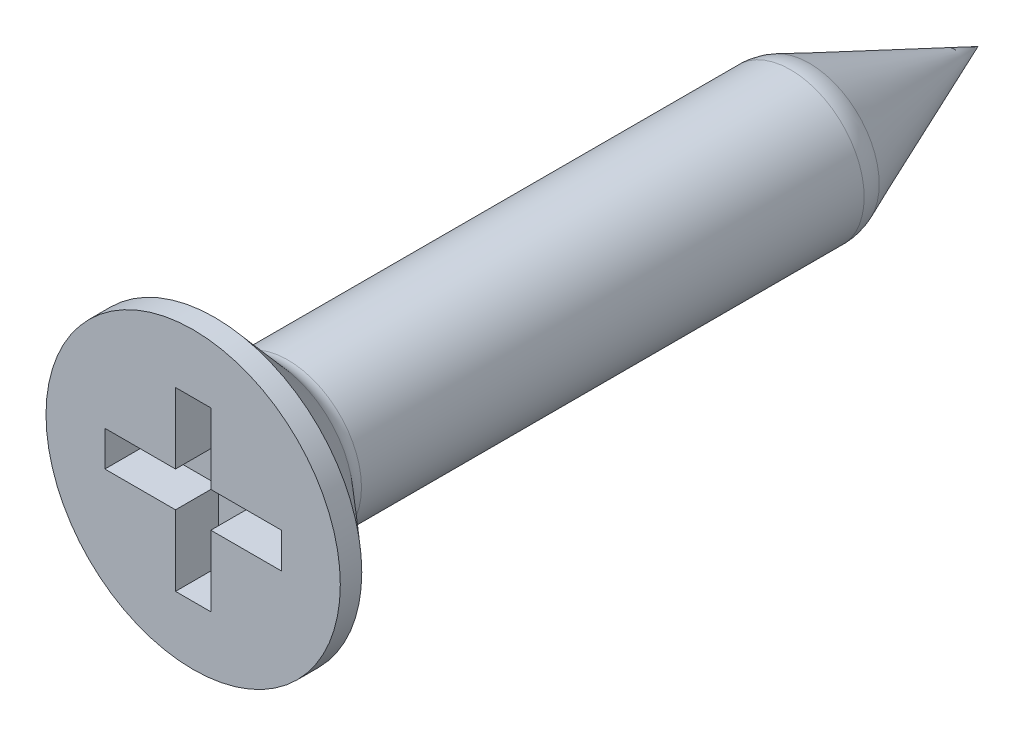
ISO-10303-21;
HEADER;
FILE_DESCRIPTION(('STEP AP214'),'2;1');
FILE_NAME('part.step','',(''),(''),'','','');
FILE_SCHEMA(('AUTOMOTIVE_DESIGN { 1 0 10303 214 1 1 1 1 }'));
ENDSEC;
DATA;
#1=APPLICATION_CONTEXT('core data for automotive mechanical design processes');
#2=APPLICATION_PROTOCOL_DEFINITION('international standard','automotive_design',2000,#1);
#3=PRODUCT_CONTEXT('',#1,'mechanical');
#4=PRODUCT('Part','Part','',(#3));
#5=PRODUCT_RELATED_PRODUCT_CATEGORY('part','',(#4));
#6=PRODUCT_DEFINITION_FORMATION('','',#4);
#7=PRODUCT_DEFINITION_CONTEXT('part definition',#1,'design');
#8=PRODUCT_DEFINITION('design','',#6,#7);
#9=PRODUCT_DEFINITION_SHAPE('','',#8);
#10=(LENGTH_UNIT() NAMED_UNIT(*) SI_UNIT(.MILLI.,.METRE.));
#11=(NAMED_UNIT(*) PLANE_ANGLE_UNIT() SI_UNIT($,.RADIAN.));
#12=(NAMED_UNIT(*) SI_UNIT($,.STERADIAN.) SOLID_ANGLE_UNIT());
#13=UNCERTAINTY_MEASURE_WITH_UNIT(LENGTH_MEASURE(1.E-05),#10,'distance_accuracy_value','');
#14=(GEOMETRIC_REPRESENTATION_CONTEXT(3) GLOBAL_UNCERTAINTY_ASSIGNED_CONTEXT((#13)) GLOBAL_UNIT_ASSIGNED_CONTEXT((#10,
#11,#12)) REPRESENTATION_CONTEXT('',''));
#15=CARTESIAN_POINT('',(0.,0.,0.));
#16=DIRECTION('',(0.,0.,1.));
#17=DIRECTION('',(1.,0.,0.));
#18=AXIS2_PLACEMENT_3D('',#15,#16,#17);
#19=CARTESIAN_POINT('',(0.,0.,94.2432124352331));
#20=DIRECTION('',(0.,0.,1.));
#21=DIRECTION('',(1.,0.,0.));
#22=AXIS2_PLACEMENT_3D('',#19,#20,#21);
#23=CYLINDRICAL_SURFACE('',#22,3.);
#24=CARTESIAN_POINT('',(0.,0.,1.75));
#25=DIRECTION('',(0.,0.,1.));
#26=DIRECTION('',(1.,0.,0.));
#27=AXIS2_PLACEMENT_3D('',#24,#25,#26);
#28=CIRCLE('',#27,3.);
#29=CARTESIAN_POINT('',(3.,0.,1.75));
#30=VERTEX_POINT('',#29);
#31=EDGE_CURVE('E239',#30,#30,#28,.T.);
#32=ORIENTED_EDGE('',*,*,#31,.F.);
#33=EDGE_LOOP('',(#32));
#34=FACE_BOUND('',#33,.T.);
#35=CARTESIAN_POINT('',(0.,0.,1.3125));
#36=DIRECTION('',(0.,0.,1.));
#37=DIRECTION('',(1.,0.,0.));
#38=AXIS2_PLACEMENT_3D('',#35,#36,#37);
#39=CIRCLE('',#38,3.);
#40=CARTESIAN_POINT('',(3.,0.,1.3125));
#41=VERTEX_POINT('',#40);
#42=EDGE_CURVE('E271',#41,#41,#39,.T.);
#43=ORIENTED_EDGE('',*,*,#42,.T.);
#44=EDGE_LOOP('',(#43));
#45=FACE_BOUND('',#44,.T.);
#46=ADVANCED_FACE('F40',(#34,#45),#23,.T.);
#47=CARTESIAN_POINT('',(0.,0.,0.));
#48=DIRECTION('',(0.,0.,1.));
#49=DIRECTION('',(1.,0.,0.));
#50=AXIS2_PLACEMENT_3D('',#47,#48,#49);
#51=CONICAL_SURFACE('',#50,1.5,0.851966327173272);
#52=CARTESIAN_POINT('',(0.,0.,0.119523387246018));
#53=DIRECTION('',(0.,0.,1.));
#54=DIRECTION('',(1.,0.,0.));
#55=AXIS2_PLACEMENT_3D('',#52,#53,#54);
#56=CIRCLE('',#55,1.63659815685259);
#57=CARTESIAN_POINT('',(1.63659815685259,0.,0.119523387246018));
#58=VERTEX_POINT('',#57);
#59=EDGE_CURVE('E275',#58,#58,#56,.T.);
#60=ORIENTED_EDGE('',*,*,#59,.T.);
#61=EDGE_LOOP('',(#60));
#62=FACE_BOUND('',#61,.T.);
#63=ORIENTED_EDGE('',*,*,#42,.F.);
#64=EDGE_LOOP('',(#63));
#65=FACE_BOUND('',#64,.T.);
#66=ADVANCED_FACE('F298',(#62,#65),#51,.T.);
#67=CARTESIAN_POINT('',(0.,0.,94.2432124352331));
#68=DIRECTION('',(0.,0.,1.));
#69=DIRECTION('',(1.,0.,0.));
#70=AXIS2_PLACEMENT_3D('',#67,#68,#69);
#71=CYLINDRICAL_SURFACE('',#70,1.5);
#72=CARTESIAN_POINT('',(0.,0.,-10.4297672890606));
#73=DIRECTION('',(0.,0.,-1.));
#74=DIRECTION('',(-1.,0.,0.));
#75=AXIS2_PLACEMENT_3D('',#72,#73,#74);
#76=CIRCLE('',#75,1.5);
#77=CARTESIAN_POINT('',(-1.5,0.,-10.4297672890606));
#78=VERTEX_POINT('',#77);
#79=EDGE_CURVE('E49',#78,#78,#76,.F.);
#80=ORIENTED_EDGE('',*,*,#79,.T.);
#81=EDGE_LOOP('',(#80));
#82=FACE_BOUND('',#81,.T.);
#83=CARTESIAN_POINT('',(0.,0.,-0.181507290636734));
#84=DIRECTION('',(0.,0.,1.));
#85=DIRECTION('',(1.,0.,0.));
#86=AXIS2_PLACEMENT_3D('',#83,#84,#85);
#87=CIRCLE('',#86,1.5);
#88=CARTESIAN_POINT('',(1.5,0.,-0.181507290636734));
#89=VERTEX_POINT('',#88);
#90=EDGE_CURVE('E279',#89,#89,#87,.F.);
#91=ORIENTED_EDGE('',*,*,#90,.T.);
#92=EDGE_LOOP('',(#91));
#93=FACE_BOUND('',#92,.T.);
#94=ADVANCED_FACE('F286',(#82,#93),#71,.T.);
#95=CARTESIAN_POINT('',(0.,0.,-14.25));
#96=DIRECTION('',(0.,0.,1.));
#97=DIRECTION('',(1.,0.,0.));
#98=AXIS2_PLACEMENT_3D('',#95,#96,#97);
#99=CONICAL_SURFACE('',#98,0.,0.392699081698717);
#100=CARTESIAN_POINT('',(0.,0.,-10.8124507214257));
#101=DIRECTION('',(0.,0.,-1.));
#102=DIRECTION('',(-1.,0.,0.));
#103=AXIS2_PLACEMENT_3D('',#100,#101,#102);
#104=CIRCLE('',#103,1.42387953251129);
#105=CARTESIAN_POINT('',(-1.42387953251129,0.,-10.8124507214257));
#106=VERTEX_POINT('',#105);
#107=EDGE_CURVE('E11',#106,#106,#104,.T.);
#108=ORIENTED_EDGE('',*,*,#107,.T.);
#109=EDGE_LOOP('',(#108));
#110=FACE_BOUND('',#109,.T.);
#111=CARTESIAN_POINT('',(0.,0.,-14.25));
#112=VERTEX_POINT('',#111);
#113=VERTEX_LOOP('',#112);
#114=FACE_BOUND('',#113,.T.);
#115=ADVANCED_FACE('F311',(#110,#114),#99,.T.);
#116=CARTESIAN_POINT('',(0.,0.,1.75));
#117=DIRECTION('',(0.,0.,-1.));
#118=DIRECTION('',(-1.,0.,0.));
#119=AXIS2_PLACEMENT_3D('',#116,#117,#118);
#120=PLANE('',#119);
#121=DIRECTION('',(-1.,0.,0.));
#122=VECTOR('',#121,1.);
#123=CARTESIAN_POINT('',(0.,1.8,1.75));
#124=LINE('',#123,#122);
#125=CARTESIAN_POINT('',(0.36,1.8,1.75));
#126=VERTEX_POINT('',#125);
#127=CARTESIAN_POINT('',(-0.36,1.8,1.75));
#128=VERTEX_POINT('',#127);
#129=EDGE_CURVE('E147',#126,#128,#124,.T.);
#130=ORIENTED_EDGE('',*,*,#129,.F.);
#131=DIRECTION('',(0.,1.,0.));
#132=VECTOR('',#131,1.);
#133=CARTESIAN_POINT('',(0.36,0.36,1.75));
#134=LINE('',#133,#132);
#135=CARTESIAN_POINT('',(0.36,0.36,1.75));
#136=VERTEX_POINT('',#135);
#137=EDGE_CURVE('E56',#136,#126,#134,.T.);
#138=ORIENTED_EDGE('',*,*,#137,.F.);
#139=DIRECTION('',(-1.,0.,0.));
#140=VECTOR('',#139,1.);
#141=CARTESIAN_POINT('',(1.8,0.36,1.75));
#142=LINE('',#141,#140);
#143=CARTESIAN_POINT('',(1.8,0.36,1.75));
#144=VERTEX_POINT('',#143);
#145=EDGE_CURVE('E230',#144,#136,#142,.T.);
#146=ORIENTED_EDGE('',*,*,#145,.F.);
#147=DIRECTION('',(0.,1.,0.));
#148=VECTOR('',#147,1.);
#149=CARTESIAN_POINT('',(1.8,0.,1.75));
#150=LINE('',#149,#148);
#151=CARTESIAN_POINT('',(1.8,-0.36,1.75));
#152=VERTEX_POINT('',#151);
#153=EDGE_CURVE('E226',#152,#144,#150,.T.);
#154=ORIENTED_EDGE('',*,*,#153,.F.);
#155=DIRECTION('',(1.,0.,0.));
#156=VECTOR('',#155,1.);
#157=CARTESIAN_POINT('',(0.36,-0.36,1.75));
#158=LINE('',#157,#156);
#159=CARTESIAN_POINT('',(0.36,-0.36,1.75));
#160=VERTEX_POINT('',#159);
#161=EDGE_CURVE('E222',#160,#152,#158,.T.);
#162=ORIENTED_EDGE('',*,*,#161,.F.);
#163=DIRECTION('',(0.,1.,0.));
#164=VECTOR('',#163,1.);
#165=CARTESIAN_POINT('',(0.36,-1.8,1.75));
#166=LINE('',#165,#164);
#167=CARTESIAN_POINT('',(0.36,-1.8,1.75));
#168=VERTEX_POINT('',#167);
#169=EDGE_CURVE('E218',#168,#160,#166,.T.);
#170=ORIENTED_EDGE('',*,*,#169,.F.);
#171=DIRECTION('',(1.,0.,0.));
#172=VECTOR('',#171,1.);
#173=CARTESIAN_POINT('',(0.,-1.8,1.75));
#174=LINE('',#173,#172);
#175=CARTESIAN_POINT('',(-0.36,-1.8,1.75));
#176=VERTEX_POINT('',#175);
#177=EDGE_CURVE('E214',#176,#168,#174,.T.);
#178=ORIENTED_EDGE('',*,*,#177,.F.);
#179=DIRECTION('',(0.,-1.,0.));
#180=VECTOR('',#179,1.);
#181=CARTESIAN_POINT('',(-0.36,-0.36,1.75));
#182=LINE('',#181,#180);
#183=CARTESIAN_POINT('',(-0.36,-0.36,1.75));
#184=VERTEX_POINT('',#183);
#185=EDGE_CURVE('E210',#184,#176,#182,.T.);
#186=ORIENTED_EDGE('',*,*,#185,.F.);
#187=DIRECTION('',(1.,0.,0.));
#188=VECTOR('',#187,1.);
#189=CARTESIAN_POINT('',(-1.8,-0.36,1.75));
#190=LINE('',#189,#188);
#191=CARTESIAN_POINT('',(-1.8,-0.36,1.75));
#192=VERTEX_POINT('',#191);
#193=EDGE_CURVE('E206',#192,#184,#190,.T.);
#194=ORIENTED_EDGE('',*,*,#193,.F.);
#195=DIRECTION('',(0.,-1.,0.));
#196=VECTOR('',#195,1.);
#197=CARTESIAN_POINT('',(-1.8,0.,1.75));
#198=LINE('',#197,#196);
#199=CARTESIAN_POINT('',(-1.8,0.36,1.75));
#200=VERTEX_POINT('',#199);
#201=EDGE_CURVE('E202',#200,#192,#198,.T.);
#202=ORIENTED_EDGE('',*,*,#201,.F.);
#203=DIRECTION('',(-1.,0.,0.));
#204=VECTOR('',#203,1.);
#205=CARTESIAN_POINT('',(-0.36,0.36,1.75));
#206=LINE('',#205,#204);
#207=CARTESIAN_POINT('',(-0.36,0.36,1.75));
#208=VERTEX_POINT('',#207);
#209=EDGE_CURVE('E198',#208,#200,#206,.T.);
#210=ORIENTED_EDGE('',*,*,#209,.F.);
#211=DIRECTION('',(0.,-1.,0.));
#212=VECTOR('',#211,1.);
#213=CARTESIAN_POINT('',(-0.36,1.8,1.75));
#214=LINE('',#213,#212);
#215=EDGE_CURVE('E195',#128,#208,#214,.T.);
#216=ORIENTED_EDGE('',*,*,#215,.F.);
#217=EDGE_LOOP('',(#130,#138,#146,#154,#162,#170,#178,#186,#194,#202,#210,#216));
#218=FACE_BOUND('',#217,.T.);
#219=ORIENTED_EDGE('',*,*,#31,.T.);
#220=EDGE_LOOP('',(#219));
#221=FACE_BOUND('',#220,.T.);
#222=ADVANCED_FACE('F314',(#218,#221),#120,.F.);
#223=CARTESIAN_POINT('',(0.36,0.36,0.875));
#224=DIRECTION('',(1.,0.,0.));
#225=DIRECTION('',(0.,1.,0.));
#226=AXIS2_PLACEMENT_3D('',#223,#224,#225);
#227=PLANE('',#226);
#228=ORIENTED_EDGE('',*,*,#137,.T.);
#229=DIRECTION('',(0.,0.,1.));
#230=VECTOR('',#229,1.);
#231=CARTESIAN_POINT('',(0.36,1.8,0.875));
#232=LINE('',#231,#230);
#233=CARTESIAN_POINT('',(0.36,1.8,0.875));
#234=VERTEX_POINT('',#233);
#235=EDGE_CURVE('E236',#234,#126,#232,.T.);
#236=ORIENTED_EDGE('',*,*,#235,.F.);
#237=DIRECTION('',(0.,1.,0.));
#238=VECTOR('',#237,1.);
#239=CARTESIAN_POINT('',(0.36,0.36,0.875));
#240=LINE('',#239,#238);
#241=CARTESIAN_POINT('',(0.36,0.36,0.875));
#242=VERTEX_POINT('',#241);
#243=EDGE_CURVE('E139',#242,#234,#240,.T.);
#244=ORIENTED_EDGE('',*,*,#243,.F.);
#245=DIRECTION('',(0.,0.,1.));
#246=VECTOR('',#245,1.);
#247=CARTESIAN_POINT('',(0.36,0.36,0.875));
#248=LINE('',#247,#246);
#249=EDGE_CURVE('E240',#242,#136,#248,.T.);
#250=ORIENTED_EDGE('',*,*,#249,.T.);
#251=EDGE_LOOP('',(#228,#236,#244,#250));
#252=FACE_BOUND('',#251,.T.);
#253=ADVANCED_FACE('F318',(#252),#227,.F.);
#254=CARTESIAN_POINT('',(1.8,0.36,0.875));
#255=DIRECTION('',(0.,1.,0.));
#256=DIRECTION('',(-1.,0.,0.));
#257=AXIS2_PLACEMENT_3D('',#254,#255,#256);
#258=PLANE('',#257);
#259=ORIENTED_EDGE('',*,*,#145,.T.);
#260=ORIENTED_EDGE('',*,*,#249,.F.);
#261=DIRECTION('',(-1.,0.,0.));
#262=VECTOR('',#261,1.);
#263=CARTESIAN_POINT('',(1.8,0.36,0.875));
#264=LINE('',#263,#262);
#265=CARTESIAN_POINT('',(1.8,0.36,0.875));
#266=VERTEX_POINT('',#265);
#267=EDGE_CURVE('E188',#266,#242,#264,.T.);
#268=ORIENTED_EDGE('',*,*,#267,.F.);
#269=DIRECTION('',(0.,0.,1.));
#270=VECTOR('',#269,1.);
#271=CARTESIAN_POINT('',(1.8,0.36,0.875));
#272=LINE('',#271,#270);
#273=EDGE_CURVE('E243',#266,#144,#272,.T.);
#274=ORIENTED_EDGE('',*,*,#273,.T.);
#275=EDGE_LOOP('',(#259,#260,#268,#274));
#276=FACE_BOUND('',#275,.T.);
#277=ADVANCED_FACE('F355',(#276),#258,.F.);
#278=CARTESIAN_POINT('',(1.8,0.,0.875));
#279=DIRECTION('',(1.,0.,0.));
#280=DIRECTION('',(0.,1.,0.));
#281=AXIS2_PLACEMENT_3D('',#278,#279,#280);
#282=PLANE('',#281);
#283=ORIENTED_EDGE('',*,*,#153,.T.);
#284=ORIENTED_EDGE('',*,*,#273,.F.);
#285=DIRECTION('',(0.,1.,0.));
#286=VECTOR('',#285,1.);
#287=CARTESIAN_POINT('',(1.8,-0.36,0.875));
#288=LINE('',#287,#286);
#289=CARTESIAN_POINT('',(1.8,-0.36,0.875));
#290=VERTEX_POINT('',#289);
#291=EDGE_CURVE('E185',#290,#266,#288,.T.);
#292=ORIENTED_EDGE('',*,*,#291,.F.);
#293=DIRECTION('',(0.,0.,1.));
#294=VECTOR('',#293,1.);
#295=CARTESIAN_POINT('',(1.8,-0.36,0.875));
#296=LINE('',#295,#294);
#297=EDGE_CURVE('E246',#290,#152,#296,.T.);
#298=ORIENTED_EDGE('',*,*,#297,.T.);
#299=EDGE_LOOP('',(#283,#284,#292,#298));
#300=FACE_BOUND('',#299,.T.);
#301=ADVANCED_FACE('F351',(#300),#282,.F.);
#302=CARTESIAN_POINT('',(0.36,-0.36,0.875));
#303=DIRECTION('',(0.,-1.,0.));
#304=DIRECTION('',(1.,0.,0.));
#305=AXIS2_PLACEMENT_3D('',#302,#303,#304);
#306=PLANE('',#305);
#307=ORIENTED_EDGE('',*,*,#161,.T.);
#308=ORIENTED_EDGE('',*,*,#297,.F.);
#309=DIRECTION('',(1.,0.,0.));
#310=VECTOR('',#309,1.);
#311=CARTESIAN_POINT('',(0.36,-0.36,0.875));
#312=LINE('',#311,#310);
#313=CARTESIAN_POINT('',(0.36,-0.36,0.875));
#314=VERTEX_POINT('',#313);
#315=EDGE_CURVE('E181',#314,#290,#312,.T.);
#316=ORIENTED_EDGE('',*,*,#315,.F.);
#317=DIRECTION('',(0.,0.,1.));
#318=VECTOR('',#317,1.);
#319=CARTESIAN_POINT('',(0.36,-0.36,0.875));
#320=LINE('',#319,#318);
#321=EDGE_CURVE('E249',#314,#160,#320,.T.);
#322=ORIENTED_EDGE('',*,*,#321,.T.);
#323=EDGE_LOOP('',(#307,#308,#316,#322));
#324=FACE_BOUND('',#323,.T.);
#325=ADVANCED_FACE('F347',(#324),#306,.F.);
#326=CARTESIAN_POINT('',(0.36,-1.8,0.875));
#327=DIRECTION('',(1.,0.,0.));
#328=DIRECTION('',(0.,1.,0.));
#329=AXIS2_PLACEMENT_3D('',#326,#327,#328);
#330=PLANE('',#329);
#331=ORIENTED_EDGE('',*,*,#169,.T.);
#332=ORIENTED_EDGE('',*,*,#321,.F.);
#333=DIRECTION('',(0.,1.,0.));
#334=VECTOR('',#333,1.);
#335=CARTESIAN_POINT('',(0.36,-1.8,0.875));
#336=LINE('',#335,#334);
#337=CARTESIAN_POINT('',(0.36,-1.8,0.875));
#338=VERTEX_POINT('',#337);
#339=EDGE_CURVE('E177',#338,#314,#336,.T.);
#340=ORIENTED_EDGE('',*,*,#339,.F.);
#341=DIRECTION('',(0.,0.,1.));
#342=VECTOR('',#341,1.);
#343=CARTESIAN_POINT('',(0.36,-1.8,0.875));
#344=LINE('',#343,#342);
#345=EDGE_CURVE('E252',#338,#168,#344,.T.);
#346=ORIENTED_EDGE('',*,*,#345,.T.);
#347=EDGE_LOOP('',(#331,#332,#340,#346));
#348=FACE_BOUND('',#347,.T.);
#349=ADVANCED_FACE('F343',(#348),#330,.F.);
#350=CARTESIAN_POINT('',(0.,-1.8,0.875));
#351=DIRECTION('',(0.,-1.,0.));
#352=DIRECTION('',(1.,0.,0.));
#353=AXIS2_PLACEMENT_3D('',#350,#351,#352);
#354=PLANE('',#353);
#355=ORIENTED_EDGE('',*,*,#177,.T.);
#356=ORIENTED_EDGE('',*,*,#345,.F.);
#357=DIRECTION('',(1.,0.,0.));
#358=VECTOR('',#357,1.);
#359=CARTESIAN_POINT('',(-0.36,-1.8,0.875));
#360=LINE('',#359,#358);
#361=CARTESIAN_POINT('',(-0.36,-1.8,0.875));
#362=VERTEX_POINT('',#361);
#363=EDGE_CURVE('E174',#362,#338,#360,.T.);
#364=ORIENTED_EDGE('',*,*,#363,.F.);
#365=DIRECTION('',(0.,0.,1.));
#366=VECTOR('',#365,1.);
#367=CARTESIAN_POINT('',(-0.36,-1.8,0.875));
#368=LINE('',#367,#366);
#369=EDGE_CURVE('E255',#362,#176,#368,.T.);
#370=ORIENTED_EDGE('',*,*,#369,.T.);
#371=EDGE_LOOP('',(#355,#356,#364,#370));
#372=FACE_BOUND('',#371,.T.);
#373=ADVANCED_FACE('F339',(#372),#354,.F.);
#374=CARTESIAN_POINT('',(-0.36,-0.36,0.875));
#375=DIRECTION('',(-1.,0.,0.));
#376=DIRECTION('',(0.,-1.,0.));
#377=AXIS2_PLACEMENT_3D('',#374,#375,#376);
#378=PLANE('',#377);
#379=ORIENTED_EDGE('',*,*,#185,.T.);
#380=ORIENTED_EDGE('',*,*,#369,.F.);
#381=DIRECTION('',(0.,-1.,0.));
#382=VECTOR('',#381,1.);
#383=CARTESIAN_POINT('',(-0.36,-0.36,0.875));
#384=LINE('',#383,#382);
#385=CARTESIAN_POINT('',(-0.36,-0.36,0.875));
#386=VERTEX_POINT('',#385);
#387=EDGE_CURVE('E170',#386,#362,#384,.T.);
#388=ORIENTED_EDGE('',*,*,#387,.F.);
#389=DIRECTION('',(0.,0.,1.));
#390=VECTOR('',#389,1.);
#391=CARTESIAN_POINT('',(-0.36,-0.36,0.875));
#392=LINE('',#391,#390);
#393=EDGE_CURVE('E258',#386,#184,#392,.T.);
#394=ORIENTED_EDGE('',*,*,#393,.T.);
#395=EDGE_LOOP('',(#379,#380,#388,#394));
#396=FACE_BOUND('',#395,.T.);
#397=ADVANCED_FACE('F335',(#396),#378,.F.);
#398=CARTESIAN_POINT('',(-1.8,-0.36,0.875));
#399=DIRECTION('',(0.,-1.,0.));
#400=DIRECTION('',(1.,0.,0.));
#401=AXIS2_PLACEMENT_3D('',#398,#399,#400);
#402=PLANE('',#401);
#403=ORIENTED_EDGE('',*,*,#193,.T.);
#404=ORIENTED_EDGE('',*,*,#393,.F.);
#405=DIRECTION('',(1.,0.,0.));
#406=VECTOR('',#405,1.);
#407=CARTESIAN_POINT('',(-1.8,-0.36,0.875));
#408=LINE('',#407,#406);
#409=CARTESIAN_POINT('',(-1.8,-0.36,0.875));
#410=VERTEX_POINT('',#409);
#411=EDGE_CURVE('E167',#410,#386,#408,.T.);
#412=ORIENTED_EDGE('',*,*,#411,.F.);
#413=DIRECTION('',(0.,0.,1.));
#414=VECTOR('',#413,1.);
#415=CARTESIAN_POINT('',(-1.8,-0.36,0.875));
#416=LINE('',#415,#414);
#417=EDGE_CURVE('E261',#410,#192,#416,.T.);
#418=ORIENTED_EDGE('',*,*,#417,.T.);
#419=EDGE_LOOP('',(#403,#404,#412,#418));
#420=FACE_BOUND('',#419,.T.);
#421=ADVANCED_FACE('F331',(#420),#402,.F.);
#422=CARTESIAN_POINT('',(-1.8,0.,0.875));
#423=DIRECTION('',(-1.,0.,0.));
#424=DIRECTION('',(0.,-1.,0.));
#425=AXIS2_PLACEMENT_3D('',#422,#423,#424);
#426=PLANE('',#425);
#427=ORIENTED_EDGE('',*,*,#201,.T.);
#428=ORIENTED_EDGE('',*,*,#417,.F.);
#429=DIRECTION('',(0.,-1.,0.));
#430=VECTOR('',#429,1.);
#431=CARTESIAN_POINT('',(-1.8,0.36,0.875));
#432=LINE('',#431,#430);
#433=CARTESIAN_POINT('',(-1.8,0.36,0.875));
#434=VERTEX_POINT('',#433);
#435=EDGE_CURVE('E162',#434,#410,#432,.T.);
#436=ORIENTED_EDGE('',*,*,#435,.F.);
#437=DIRECTION('',(0.,0.,1.));
#438=VECTOR('',#437,1.);
#439=CARTESIAN_POINT('',(-1.8,0.36,0.875));
#440=LINE('',#439,#438);
#441=EDGE_CURVE('E264',#434,#200,#440,.T.);
#442=ORIENTED_EDGE('',*,*,#441,.T.);
#443=EDGE_LOOP('',(#427,#428,#436,#442));
#444=FACE_BOUND('',#443,.T.);
#445=ADVANCED_FACE('F327',(#444),#426,.F.);
#446=CARTESIAN_POINT('',(-0.36,0.36,0.875));
#447=DIRECTION('',(0.,1.,0.));
#448=DIRECTION('',(-1.,0.,0.));
#449=AXIS2_PLACEMENT_3D('',#446,#447,#448);
#450=PLANE('',#449);
#451=ORIENTED_EDGE('',*,*,#209,.T.);
#452=ORIENTED_EDGE('',*,*,#441,.F.);
#453=DIRECTION('',(-1.,0.,0.));
#454=VECTOR('',#453,1.);
#455=CARTESIAN_POINT('',(-0.36,0.36,0.875));
#456=LINE('',#455,#454);
#457=CARTESIAN_POINT('',(-0.36,0.36,0.875));
#458=VERTEX_POINT('',#457);
#459=EDGE_CURVE('E157',#458,#434,#456,.T.);
#460=ORIENTED_EDGE('',*,*,#459,.F.);
#461=DIRECTION('',(0.,0.,1.));
#462=VECTOR('',#461,1.);
#463=CARTESIAN_POINT('',(-0.36,0.36,0.875));
#464=LINE('',#463,#462);
#465=EDGE_CURVE('E152',#458,#208,#464,.T.);
#466=ORIENTED_EDGE('',*,*,#465,.T.);
#467=EDGE_LOOP('',(#451,#452,#460,#466));
#468=FACE_BOUND('',#467,.T.);
#469=ADVANCED_FACE('F324',(#468),#450,.F.);
#470=CARTESIAN_POINT('',(-0.36,1.8,0.875));
#471=DIRECTION('',(-1.,0.,0.));
#472=DIRECTION('',(0.,-1.,0.));
#473=AXIS2_PLACEMENT_3D('',#470,#471,#472);
#474=PLANE('',#473);
#475=ORIENTED_EDGE('',*,*,#215,.T.);
#476=ORIENTED_EDGE('',*,*,#465,.F.);
#477=DIRECTION('',(0.,-1.,0.));
#478=VECTOR('',#477,1.);
#479=CARTESIAN_POINT('',(-0.36,1.8,0.875));
#480=LINE('',#479,#478);
#481=CARTESIAN_POINT('',(-0.36,1.8,0.875));
#482=VERTEX_POINT('',#481);
#483=EDGE_CURVE('E136',#482,#458,#480,.T.);
#484=ORIENTED_EDGE('',*,*,#483,.F.);
#485=DIRECTION('',(0.,0.,1.));
#486=VECTOR('',#485,1.);
#487=CARTESIAN_POINT('',(-0.36,1.8,0.875));
#488=LINE('',#487,#486);
#489=EDGE_CURVE('E144',#482,#128,#488,.T.);
#490=ORIENTED_EDGE('',*,*,#489,.T.);
#491=EDGE_LOOP('',(#475,#476,#484,#490));
#492=FACE_BOUND('',#491,.T.);
#493=ADVANCED_FACE('F154',(#492),#474,.F.);
#494=CARTESIAN_POINT('',(0.,1.8,0.875));
#495=DIRECTION('',(0.,1.,0.));
#496=DIRECTION('',(-1.,0.,0.));
#497=AXIS2_PLACEMENT_3D('',#494,#495,#496);
#498=PLANE('',#497);
#499=ORIENTED_EDGE('',*,*,#129,.T.);
#500=ORIENTED_EDGE('',*,*,#489,.F.);
#501=DIRECTION('',(-1.,0.,0.));
#502=VECTOR('',#501,1.);
#503=CARTESIAN_POINT('',(0.36,1.8,0.875));
#504=LINE('',#503,#502);
#505=EDGE_CURVE('E131',#234,#482,#504,.T.);
#506=ORIENTED_EDGE('',*,*,#505,.F.);
#507=ORIENTED_EDGE('',*,*,#235,.T.);
#508=EDGE_LOOP('',(#499,#500,#506,#507));
#509=FACE_BOUND('',#508,.T.);
#510=ADVANCED_FACE('F145',(#509),#498,.F.);
#511=CARTESIAN_POINT('',(-1.8,1.8,0.875));
#512=DIRECTION('',(0.,0.,1.));
#513=DIRECTION('',(1.,0.,0.));
#514=AXIS2_PLACEMENT_3D('',#511,#512,#513);
#515=PLANE('',#514);
#516=ORIENTED_EDGE('',*,*,#505,.T.);
#517=ORIENTED_EDGE('',*,*,#483,.T.);
#518=ORIENTED_EDGE('',*,*,#459,.T.);
#519=ORIENTED_EDGE('',*,*,#435,.T.);
#520=ORIENTED_EDGE('',*,*,#411,.T.);
#521=ORIENTED_EDGE('',*,*,#387,.T.);
#522=ORIENTED_EDGE('',*,*,#363,.T.);
#523=ORIENTED_EDGE('',*,*,#339,.T.);
#524=ORIENTED_EDGE('',*,*,#315,.T.);
#525=ORIENTED_EDGE('',*,*,#291,.T.);
#526=ORIENTED_EDGE('',*,*,#267,.T.);
#527=ORIENTED_EDGE('',*,*,#243,.T.);
#528=EDGE_LOOP('',(#516,#517,#518,#519,#520,#521,#522,#523,#524,#525,#526,#527));
#529=FACE_BOUND('',#528,.T.);
#530=ADVANCED_FACE('F133',(#529),#515,.T.);
#531=CARTESIAN_POINT('',(0.,0.,-0.181507290636734));
#532=DIRECTION('',(0.,0.,1.));
#533=DIRECTION('',(1.,0.,0.));
#534=AXIS2_PLACEMENT_3D('',#531,#532,#533);
#535=TOROIDAL_SURFACE('',#534,1.9,0.4);
#536=ORIENTED_EDGE('',*,*,#90,.F.);
#537=EDGE_LOOP('',(#536));
#538=FACE_BOUND('',#537,.T.);
#539=ORIENTED_EDGE('',*,*,#59,.F.);
#540=EDGE_LOOP('',(#539));
#541=FACE_BOUND('',#540,.T.);
#542=ADVANCED_FACE('F290',(#538,#541),#535,.F.);
#543=CARTESIAN_POINT('',(0.,0.,-10.4297672890606));
#544=DIRECTION('',(0.,0.,-1.));
#545=DIRECTION('',(-1.,0.,0.));
#546=AXIS2_PLACEMENT_3D('',#543,#544,#545);
#547=DEGENERATE_TOROIDAL_SURFACE('',#546,0.5,1.,.T.);
#548=ORIENTED_EDGE('',*,*,#107,.F.);
#549=EDGE_LOOP('',(#548));
#550=FACE_BOUND('',#549,.T.);
#551=ORIENTED_EDGE('',*,*,#79,.F.);
#552=EDGE_LOOP('',(#551));
#553=FACE_BOUND('',#552,.T.);
#554=ADVANCED_FACE('F42',(#550,#553),#547,.T.);
#555=CLOSED_SHELL('',(#46,#66,#94,#115,#222,#253,#277,#301,#325,#349,#373,#397,#421,#445,#469,
#493,#510,#530,#542,#554));
#556=MANIFOLD_SOLID_BREP('B2',#555);
#557=ADVANCED_BREP_SHAPE_REPRESENTATION('',(#18,#556),#14);
#558=SHAPE_DEFINITION_REPRESENTATION(#9,#557);
ENDSEC;
END-ISO-10303-21;
